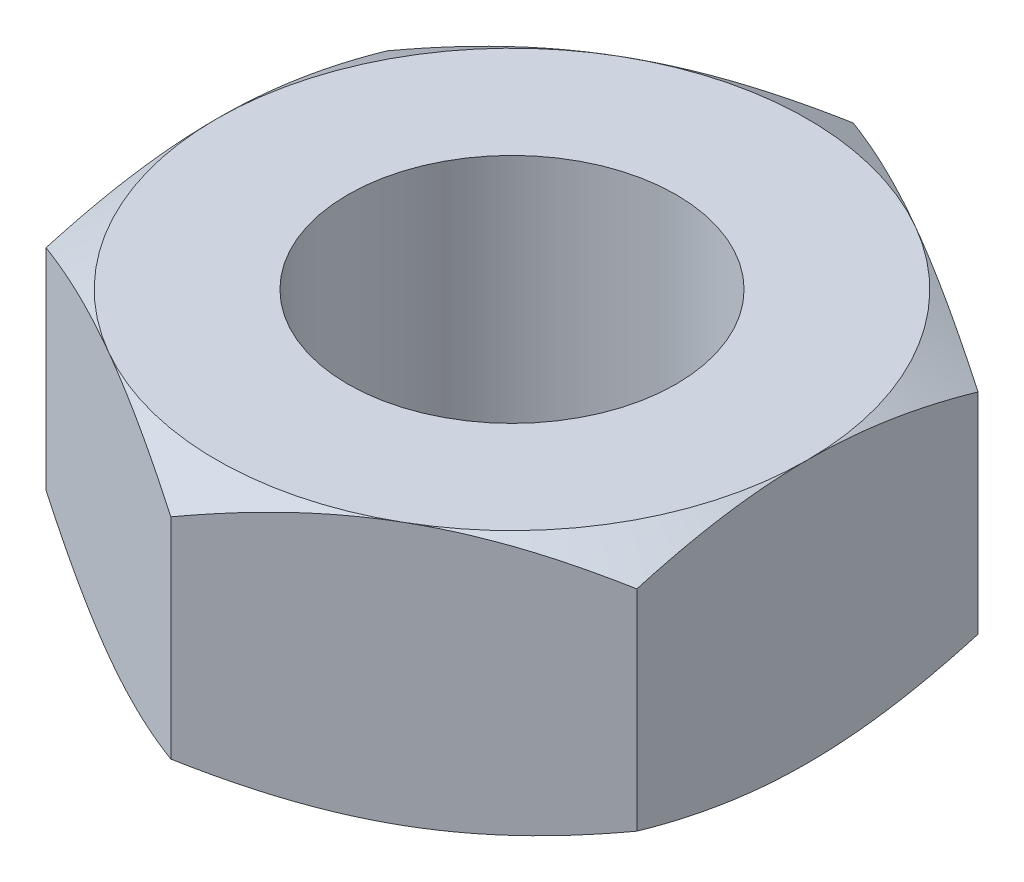
ISO-10303-21;
HEADER;
FILE_DESCRIPTION(('STEP AP214'),'2;1');
FILE_NAME('part.step','',(''),(''),'','','');
FILE_SCHEMA(('AUTOMOTIVE_DESIGN { 1 0 10303 214 1 1 1 1 }'));
ENDSEC;
DATA;
#1=APPLICATION_CONTEXT('core data for automotive mechanical design processes');
#2=APPLICATION_PROTOCOL_DEFINITION('international standard','automotive_design',2000,#1);
#3=PRODUCT_CONTEXT('',#1,'mechanical');
#4=PRODUCT('Part','Part','',(#3));
#5=PRODUCT_RELATED_PRODUCT_CATEGORY('part','',(#4));
#6=PRODUCT_DEFINITION_FORMATION('','',#4);
#7=PRODUCT_DEFINITION_CONTEXT('part definition',#1,'design');
#8=PRODUCT_DEFINITION('design','',#6,#7);
#9=PRODUCT_DEFINITION_SHAPE('','',#8);
#10=(LENGTH_UNIT() NAMED_UNIT(*) SI_UNIT(.MILLI.,.METRE.));
#11=(NAMED_UNIT(*) PLANE_ANGLE_UNIT() SI_UNIT($,.RADIAN.));
#12=(NAMED_UNIT(*) SI_UNIT($,.STERADIAN.) SOLID_ANGLE_UNIT());
#13=UNCERTAINTY_MEASURE_WITH_UNIT(LENGTH_MEASURE(1.E-05),#10,'distance_accuracy_value','');
#14=(GEOMETRIC_REPRESENTATION_CONTEXT(3) GLOBAL_UNCERTAINTY_ASSIGNED_CONTEXT((#13)) GLOBAL_UNIT_ASSIGNED_CONTEXT((#10,
#11,#12)) REPRESENTATION_CONTEXT('',''));
#15=CARTESIAN_POINT('',(0.,0.,0.));
#16=DIRECTION('',(0.,0.,1.));
#17=DIRECTION('',(1.,0.,0.));
#18=AXIS2_PLACEMENT_3D('',#15,#16,#17);
#19=CARTESIAN_POINT('',(2.25,2.,-1.29903810567666));
#20=DIRECTION('',(-0.5,0.,0.866025403784439));
#21=DIRECTION('',(0.866025403784439,0.,0.5));
#22=AXIS2_PLACEMENT_3D('',#19,#20,#21);
#23=PLANE('',#22);
#24=CARTESIAN_POINT('',(-0.000200000000000746,0.201028565434254,-2.59819168140715));
#25=CARTESIAN_POINT('',(0.0986772488143565,0.168055578047863,-2.54110487518745));
#26=CARTESIAN_POINT('',(0.198407997179093,0.138067535415597,-2.48352530077259));
#27=CARTESIAN_POINT('',(0.399596540220632,0.0857223882308776,-2.36736904128969));
#28=CARTESIAN_POINT('',(0.501057910502944,0.0633838027064784,-2.30879029184485));
#29=CARTESIAN_POINT('',(0.702723189801078,0.0286095576734187,-2.19235878855587));
#30=CARTESIAN_POINT('',(0.802896064976671,0.0159424738337181,-2.13452395210774));
#31=CARTESIAN_POINT('',(1.00371331260268,0.000818907417418591,-2.01858206013295));
#32=CARTESIAN_POINT('',(1.1043569548332,-0.00165009697600181,-1.96047542619893));
#33=CARTESIAN_POINT('',(1.29242516452656,0.00347837463602899,-1.85189419470646));
#34=CARTESIAN_POINT('',(1.37987784389126,0.00981663451512003,-1.8014033667339));
#35=CARTESIAN_POINT('',(1.55421343210877,0.0299076571898887,-1.70075066794718));
#36=CARTESIAN_POINT('',(1.64109573768829,0.0436672872310832,-1.65058914543304));
#37=CARTESIAN_POINT('',(1.81579095410173,0.078066265350665,-1.54972881521059));
#38=CARTESIAN_POINT('',(1.90358174743525,0.098851471582655,-1.49904277704711));
#39=CARTESIAN_POINT('',(2.07785373687759,0.146026087362979,-1.39842679703037));
#40=CARTESIAN_POINT('',(2.164337166751,0.172404408014301,-1.34849556551251));
#41=CARTESIAN_POINT('',(2.2502,0.201028565434254,-1.29892263562282));
#42=B_SPLINE_CURVE_WITH_KNOTS('',3,(#24,#25,#26,#27,#28,#29,#30,#31,#32,#33,#34,#35,#36,#37,#38,
#39,#40,#41),.UNSPECIFIED.,.F.,.F.,(4,2,2,2,2,2,2,2,4),(0.,0.356658826016552,0.714175103224236,
1.06284241804968,1.41108149062516,1.71433394539794,2.01786749258222,2.32813511279245,
2.63779325460359),.UNSPECIFIED.);
#43=CARTESIAN_POINT('',(0.,0.200961894323341,-2.59807621135332));
#44=VERTEX_POINT('',#43);
#45=CARTESIAN_POINT('',(1.125,0.,-1.94855715851499));
#46=VERTEX_POINT('',#45);
#47=EDGE_CURVE('E53',#44,#46,#42,.T.);
#48=ORIENTED_EDGE('',*,*,#47,.F.);
#49=DIRECTION('',(0.,-1.,0.));
#50=VECTOR('',#49,1.);
#51=CARTESIAN_POINT('',(0.,2.,-2.59807621135332));
#52=LINE('',#51,#50);
#53=CARTESIAN_POINT('',(0.,1.79903810567666,-2.59807621135332));
#54=VERTEX_POINT('',#53);
#55=EDGE_CURVE('E279',#54,#44,#52,.T.);
#56=ORIENTED_EDGE('',*,*,#55,.F.);
#57=CARTESIAN_POINT('',(2.2502,1.79897143456575,-1.29892263562282));
#58=CARTESIAN_POINT('',(2.15132275118564,1.83194442195214,-1.35600944184252));
#59=CARTESIAN_POINT('',(2.05159200282091,1.8619324645844,-1.41358901625738));
#60=CARTESIAN_POINT('',(1.85040345977937,1.91427761176912,-1.52974527574028));
#61=CARTESIAN_POINT('',(1.74894208949705,1.93661619729352,-1.58832402518513));
#62=CARTESIAN_POINT('',(1.54727681019892,1.97139044232658,-1.7047555284741));
#63=CARTESIAN_POINT('',(1.44710393502333,1.98405752616628,-1.76259036492223));
#64=CARTESIAN_POINT('',(1.24628668739732,1.99918109258258,-1.87853225689702));
#65=CARTESIAN_POINT('',(1.1456430451668,2.001650096976,-1.93663889083104));
#66=CARTESIAN_POINT('',(0.957574835473434,1.99652162536397,-2.04522012232352));
#67=CARTESIAN_POINT('',(0.870122156108741,1.99018336548488,-2.09571095029608));
#68=CARTESIAN_POINT('',(0.695786567891225,1.97009234281011,-2.19636364908279));
#69=CARTESIAN_POINT('',(0.608904262311711,1.95633271276892,-2.24652517159694));
#70=CARTESIAN_POINT('',(0.434209045898263,1.92193373464933,-2.34738550181938));
#71=CARTESIAN_POINT('',(0.346418252564746,1.90114852841734,-2.39807153998286));
#72=CARTESIAN_POINT('',(0.172146263122404,1.85397391263702,-2.49868751999961));
#73=CARTESIAN_POINT('',(0.0856628332489969,1.8275955919857,-2.54861875151746));
#74=CARTESIAN_POINT('',(-0.000200000000000684,1.79897143456575,-2.59819168140715));
#75=B_SPLINE_CURVE_WITH_KNOTS('',3,(#57,#58,#59,#60,#61,#62,#63,#64,#65,#66,#67,#68,#69,#70,#71,
#72,#73,#74),.UNSPECIFIED.,.F.,.F.,(4,2,2,2,2,2,2,2,4),(0.,0.356658826016552,0.714175103224236,
1.06284241804968,1.41108149062516,1.71433394539794,2.01786749258222,2.32813511279245,
2.63779325460359),.UNSPECIFIED.);
#76=CARTESIAN_POINT('',(1.125,2.,-1.94855715851499));
#77=VERTEX_POINT('',#76);
#78=EDGE_CURVE('E251',#77,#54,#75,.T.);
#79=ORIENTED_EDGE('',*,*,#78,.F.);
#80=CARTESIAN_POINT('',(2.25,1.79903810567666,-1.29903810567666));
#81=VERTEX_POINT('',#80);
#82=EDGE_CURVE('E319',#81,#77,#75,.T.);
#83=ORIENTED_EDGE('',*,*,#82,.F.);
#84=DIRECTION('',(0.,-1.,0.));
#85=VECTOR('',#84,1.);
#86=CARTESIAN_POINT('',(2.25,2.,-1.29903810567666));
#87=LINE('',#86,#85);
#88=CARTESIAN_POINT('',(2.25,0.200961894323341,-1.29903810567666));
#89=VERTEX_POINT('',#88);
#90=EDGE_CURVE('E321',#81,#89,#87,.T.);
#91=ORIENTED_EDGE('',*,*,#90,.T.);
#92=EDGE_CURVE('E138',#46,#89,#42,.T.);
#93=ORIENTED_EDGE('',*,*,#92,.F.);
#94=EDGE_LOOP('',(#48,#56,#79,#83,#91,#93));
#95=FACE_BOUND('',#94,.T.);
#96=ADVANCED_FACE('F37',(#95),#23,.F.);
#97=CARTESIAN_POINT('',(0.,2.,-2.59807621135332));
#98=DIRECTION('',(0.5,0.,0.866025403784438));
#99=DIRECTION('',(0.866025403784439,0.,-0.5));
#100=AXIS2_PLACEMENT_3D('',#97,#98,#99);
#101=PLANE('',#100);
#102=CARTESIAN_POINT('',(-2.2502,0.201028565434254,-1.29892263562282));
#103=CARTESIAN_POINT('',(-2.15132275118564,0.168055578047863,-1.35600944184252));
#104=CARTESIAN_POINT('',(-2.05159200282091,0.138067535415598,-1.41358901625738));
#105=CARTESIAN_POINT('',(-1.85040345977937,0.0857223882308777,-1.52974527574028));
#106=CARTESIAN_POINT('',(-1.74894208949705,0.0633838027064785,-1.58832402518512));
#107=CARTESIAN_POINT('',(-1.54727681019892,0.0286095576734186,-1.7047555284741));
#108=CARTESIAN_POINT('',(-1.44710393502333,0.015942473833718,-1.76259036492223));
#109=CARTESIAN_POINT('',(-1.24628668739732,0.000818907417418527,-1.87853225689702));
#110=CARTESIAN_POINT('',(-1.1456430451668,-0.00165009697600169,-1.93663889083104));
#111=CARTESIAN_POINT('',(-0.957574835473435,0.00347837463602923,-2.04522012232352));
#112=CARTESIAN_POINT('',(-0.870122156108742,0.00981663451512021,-2.09571095029608));
#113=CARTESIAN_POINT('',(-0.695786567891226,0.0299076571898888,-2.19636364908279));
#114=CARTESIAN_POINT('',(-0.608904262311712,0.0436672872310833,-2.24652517159694));
#115=CARTESIAN_POINT('',(-0.434209045898264,0.0780662653506652,-2.34738550181938));
#116=CARTESIAN_POINT('',(-0.346418252564747,0.0988514715826553,-2.39807153998286));
#117=CARTESIAN_POINT('',(-0.172146263122406,0.146026087362979,-2.49868751999961));
#118=CARTESIAN_POINT('',(-0.0856628332489986,0.172404408014302,-2.54861875151746));
#119=CARTESIAN_POINT('',(0.000199999999999082,0.201028565434254,-2.59819168140715));
#120=B_SPLINE_CURVE_WITH_KNOTS('',3,(#102,#103,#104,#105,#106,#107,#108,#109,#110,#111,#112,
#113,#114,#115,#116,#117,#118,#119),.UNSPECIFIED.,.F.,.F.,(4,2,2,2,2,2,2,2,4),(0.,
0.356658826016552,0.714175103224237,1.06284241804968,1.41108149062516,1.71433394539794,
2.01786749258222,2.32813511279245,2.63779325460359),.UNSPECIFIED.);
#121=CARTESIAN_POINT('',(-2.25,0.200961894323341,-1.29903810567666));
#122=VERTEX_POINT('',#121);
#123=CARTESIAN_POINT('',(-1.125,0.,-1.94855715851499));
#124=VERTEX_POINT('',#123);
#125=EDGE_CURVE('E61',#122,#124,#120,.T.);
#126=ORIENTED_EDGE('',*,*,#125,.F.);
#127=DIRECTION('',(0.,-1.,0.));
#128=VECTOR('',#127,1.);
#129=CARTESIAN_POINT('',(-2.25,2.,-1.29903810567666));
#130=LINE('',#129,#128);
#131=CARTESIAN_POINT('',(-2.25,1.79903810567666,-1.29903810567666));
#132=VERTEX_POINT('',#131);
#133=EDGE_CURVE('E272',#132,#122,#130,.T.);
#134=ORIENTED_EDGE('',*,*,#133,.F.);
#135=CARTESIAN_POINT('',(0.000199999999999188,1.79897143456575,-2.59819168140715));
#136=CARTESIAN_POINT('',(-0.098677248814358,1.83194442195214,-2.54110487518745));
#137=CARTESIAN_POINT('',(-0.198407997179094,1.8619324645844,-2.48352530077259));
#138=CARTESIAN_POINT('',(-0.399596540220633,1.91427761176912,-2.36736904128969));
#139=CARTESIAN_POINT('',(-0.501057910502946,1.93661619729352,-2.30879029184485));
#140=CARTESIAN_POINT('',(-0.702723189801079,1.97139044232658,-2.19235878855587));
#141=CARTESIAN_POINT('',(-0.802896064976672,1.98405752616628,-2.13452395210774));
#142=CARTESIAN_POINT('',(-1.00371331260268,1.99918109258258,-2.01858206013295));
#143=CARTESIAN_POINT('',(-1.1043569548332,2.001650096976,-1.96047542619893));
#144=CARTESIAN_POINT('',(-1.29242516452657,1.99652162536397,-1.85189419470646));
#145=CARTESIAN_POINT('',(-1.37987784389126,1.99018336548488,-1.8014033667339));
#146=CARTESIAN_POINT('',(-1.55421343210877,1.97009234281011,-1.70075066794718));
#147=CARTESIAN_POINT('',(-1.64109573768829,1.95633271276892,-1.65058914543303));
#148=CARTESIAN_POINT('',(-1.81579095410174,1.92193373464934,-1.54972881521059));
#149=CARTESIAN_POINT('',(-1.90358174743525,1.90114852841734,-1.49904277704711));
#150=CARTESIAN_POINT('',(-2.07785373687759,1.85397391263702,-1.39842679703037));
#151=CARTESIAN_POINT('',(-2.164337166751,1.8275955919857,-1.34849556551251));
#152=CARTESIAN_POINT('',(-2.2502,1.79897143456575,-1.29892263562282));
#153=B_SPLINE_CURVE_WITH_KNOTS('',3,(#135,#136,#137,#138,#139,#140,#141,#142,#143,#144,#145,
#146,#147,#148,#149,#150,#151,#152),.UNSPECIFIED.,.F.,.F.,(4,2,2,2,2,2,2,2,4),(0.,
0.356658826016552,0.714175103224236,1.06284241804968,1.41108149062516,1.71433394539794,
2.01786749258222,2.32813511279245,2.63779325460359),.UNSPECIFIED.);
#154=CARTESIAN_POINT('',(-1.125,2.,-1.94855715851499));
#155=VERTEX_POINT('',#154);
#156=EDGE_CURVE('E244',#155,#132,#153,.T.);
#157=ORIENTED_EDGE('',*,*,#156,.F.);
#158=EDGE_CURVE('E250',#54,#155,#153,.T.);
#159=ORIENTED_EDGE('',*,*,#158,.F.);
#160=ORIENTED_EDGE('',*,*,#55,.T.);
#161=EDGE_CURVE('E161',#124,#44,#120,.T.);
#162=ORIENTED_EDGE('',*,*,#161,.F.);
#163=EDGE_LOOP('',(#126,#134,#157,#159,#160,#162));
#164=FACE_BOUND('',#163,.T.);
#165=ADVANCED_FACE('F257',(#164),#101,.F.);
#166=CARTESIAN_POINT('',(-2.25,2.,-1.29903810567666));
#167=DIRECTION('',(1.,0.,0.));
#168=DIRECTION('',(0.,0.,-1.));
#169=AXIS2_PLACEMENT_3D('',#166,#167,#168);
#170=PLANE('',#169);
#171=CARTESIAN_POINT('',(-2.25,1.61654080244333,4.52098452866437));
#172=CARTESIAN_POINT('',(-2.25,1.5622793592188,4.41599142010916));
#173=CARTESIAN_POINT('',(-2.25,1.50830287728152,4.3108497874335));
#174=CARTESIAN_POINT('',(-2.25,1.40106366051152,4.10020109263545));
#175=CARTESIAN_POINT('',(-2.25,1.34780093790971,3.99469402428986));
#176=CARTESIAN_POINT('',(-2.25,1.2420515368529,3.78308278811094));
#177=CARTESIAN_POINT('',(-2.25,1.18956621605644,3.67697794065521));
#178=CARTESIAN_POINT('',(-2.25,1.08565573015514,3.46424778031012));
#179=CARTESIAN_POINT('',(-2.25,1.0342305798221,3.35762246019437));
#180=CARTESIAN_POINT('',(-2.25,0.929974137069096,3.13800936941928));
#181=CARTESIAN_POINT('',(-2.25,0.877215361007394,3.02498707842674));
#182=CARTESIAN_POINT('',(-2.25,0.773561201286874,2.79809197620436));
#183=CARTESIAN_POINT('',(-2.25,0.722665769410085,2.6842191870749));
#184=CARTESIAN_POINT('',(-2.25,0.623312980238853,2.45549954074309));
#185=CARTESIAN_POINT('',(-2.25,0.574854022311475,2.34065338251795));
#186=CARTESIAN_POINT('',(-2.25,0.481072364029686,2.10965053432443));
#187=CARTESIAN_POINT('',(-2.25,0.435750370947091,1.99349355563509));
#188=CARTESIAN_POINT('',(-2.25,0.342786865540116,1.74211109324837));
#189=CARTESIAN_POINT('',(-2.25,0.295814277167548,1.60663482148118));
#190=CARTESIAN_POINT('',(-2.25,0.209504971922834,1.3332954791331));
#191=CARTESIAN_POINT('',(-2.25,0.170164497661105,1.19543361960658));
#192=CARTESIAN_POINT('',(-2.25,0.102545421444101,0.91980771299549));
#193=CARTESIAN_POINT('',(-2.25,0.0740661287099882,0.782094149233205));
#194=CARTESIAN_POINT('',(-2.25,0.0300512713647035,0.504588051380634));
#195=CARTESIAN_POINT('',(-2.25,0.0145079988791757,0.364796805887861));
#196=CARTESIAN_POINT('',(-2.25,0.00237042253740857,0.153462339780306));
#197=CARTESIAN_POINT('',(-2.25,0.000213996781182723,0.0822117789549771));
#198=CARTESIAN_POINT('',(-2.25,-0.000183212053853032,-0.0603054030350468));
#199=CARTESIAN_POINT('',(-2.25,0.00157599640119419,-0.131572024164684));
#200=CARTESIAN_POINT('',(-2.25,0.00895020570216545,-0.273914915401414));
#201=CARTESIAN_POINT('',(-2.25,0.0145658718900124,-0.344991150537271));
#202=CARTESIAN_POINT('',(-2.25,0.029441678996056,-0.48676591860894));
#203=CARTESIAN_POINT('',(-2.25,0.0387024235819218,-0.557464387015442));
#204=CARTESIAN_POINT('',(-2.25,0.071946724543369,-0.771646015798237));
#205=CARTESIAN_POINT('',(-2.25,0.101223215970863,-0.914319075380874));
#206=CARTESIAN_POINT('',(-2.25,0.170517946349336,-1.19697326353253));
#207=CARTESIAN_POINT('',(-2.25,0.210540113399167,-1.33695338760176));
#208=CARTESIAN_POINT('',(-2.25,0.29773955454535,-1.61234208513247));
#209=CARTESIAN_POINT('',(-2.25,0.34480189493785,-1.74778767009234));
#210=CARTESIAN_POINT('',(-2.25,0.444406417047665,-2.01666306398133));
#211=CARTESIAN_POINT('',(-2.25,0.496950100596509,-2.15009230892905));
#212=CARTESIAN_POINT('',(-2.25,0.606064881357971,-2.41545563737938));
#213=CARTESIAN_POINT('',(-2.25,0.66264044094819,-2.5473878708551));
#214=CARTESIAN_POINT('',(-2.25,0.778720831616846,-2.8099590060791));
#215=CARTESIAN_POINT('',(-2.25,0.838225833570133,-2.94059783184758));
#216=CARTESIAN_POINT('',(-2.25,0.955861758041666,-3.19318812855259));
#217=CARTESIAN_POINT('',(-2.25,1.01386731062023,-3.31519822826409));
#218=CARTESIAN_POINT('',(-2.25,1.13138940640331,-3.55849232400213));
#219=CARTESIAN_POINT('',(-2.25,1.19090600389569,-3.67977629374671));
#220=CARTESIAN_POINT('',(-2.25,1.31091123446663,-3.92132491393736));
#221=CARTESIAN_POINT('',(-2.25,1.37139567148893,-4.04159165394789));
#222=CARTESIAN_POINT('',(-2.25,1.49331218297334,-4.28163063441634));
#223=CARTESIAN_POINT('',(-2.25,1.5547441718645,-4.40140291830326));
#224=CARTESIAN_POINT('',(-2.25,1.61654080244333,-4.52098452866437));
#225=B_SPLINE_CURVE_WITH_KNOTS('',3,(#171,#172,#173,#174,#175,#176,#177,#178,#179,#180,#181,
#182,#183,#184,#185,#186,#187,#188,#189,#190,#191,#192,#193,#194,#195,#196,#197,#198,#199,#200,
#201,#202,#203,#204,#205,#206,#207,#208,#209,#210,#211,#212,#213,#214,#215,#216,#217,#218,#219,
#220,#221,#222,#223,#224),.UNSPECIFIED.,.F.,.F.,(4,2,2,2,2,2,2,2,2,2,2,2,2,2,2,2,2,2,2,2,2,2,2,
2,2,2,4),(0.,0.354558289452689,0.709122646842152,1.06424666910254,1.4193756361108,
1.79355189161133,2.16771845765633,2.54163591555203,2.91563740549302,3.34564307397043,
3.77543650480265,4.19685151312074,4.61801524290633,4.83177056313858,5.0455254212027,
5.25931716695487,5.47314433403134,5.90946317070491,6.34594172209233,6.77594617504564,
7.20606875577625,7.63667500851675,8.06730640841919,8.47258371771617,8.87787560822175,
9.28173008673865,9.68554830529466),.UNSPECIFIED.);
#226=CARTESIAN_POINT('',(-2.25,0.20096189432334,1.29903810567666));
#227=VERTEX_POINT('',#226);
#228=CARTESIAN_POINT('',(-2.25,0.,0.));
#229=VERTEX_POINT('',#228);
#230=EDGE_CURVE('E348',#227,#229,#225,.T.);
#231=ORIENTED_EDGE('',*,*,#230,.F.);
#232=DIRECTION('',(0.,-1.,0.));
#233=VECTOR('',#232,1.);
#234=CARTESIAN_POINT('',(-2.25,2.,1.29903810567666));
#235=LINE('',#234,#233);
#236=CARTESIAN_POINT('',(-2.25,1.79903810567666,1.29903810567666));
#237=VERTEX_POINT('',#236);
#238=EDGE_CURVE('E280',#237,#227,#235,.T.);
#239=ORIENTED_EDGE('',*,*,#238,.F.);
#240=CARTESIAN_POINT('',(-2.25,0.383459197556667,-4.52098452866437));
#241=CARTESIAN_POINT('',(-2.25,0.437720640781204,-4.41599142010916));
#242=CARTESIAN_POINT('',(-2.25,0.491697122718478,-4.3108497874335));
#243=CARTESIAN_POINT('',(-2.25,0.598936339488484,-4.10020109263545));
#244=CARTESIAN_POINT('',(-2.25,0.652199062090288,-3.99469402428986));
#245=CARTESIAN_POINT('',(-2.25,0.757948463147099,-3.78308278811094));
#246=CARTESIAN_POINT('',(-2.25,0.810433783943564,-3.67697794065521));
#247=CARTESIAN_POINT('',(-2.25,0.91434426984486,-3.46424778031012));
#248=CARTESIAN_POINT('',(-2.25,0.965769420177905,-3.35762246019437));
#249=CARTESIAN_POINT('',(-2.25,1.0700258629309,-3.13800936941928));
#250=CARTESIAN_POINT('',(-2.25,1.12278463899261,-3.02498707842674));
#251=CARTESIAN_POINT('',(-2.25,1.22643879871313,-2.79809197620436));
#252=CARTESIAN_POINT('',(-2.25,1.27733423058991,-2.6842191870749));
#253=CARTESIAN_POINT('',(-2.25,1.37668701976115,-2.45549954074309));
#254=CARTESIAN_POINT('',(-2.25,1.42514597768852,-2.34065338251795));
#255=CARTESIAN_POINT('',(-2.25,1.51892763597031,-2.10965053432443));
#256=CARTESIAN_POINT('',(-2.25,1.56424962905291,-1.99349355563509));
#257=CARTESIAN_POINT('',(-2.25,1.65721313445988,-1.74211109324837));
#258=CARTESIAN_POINT('',(-2.25,1.70418572283245,-1.60663482148118));
#259=CARTESIAN_POINT('',(-2.25,1.79049502807717,-1.3332954791331));
#260=CARTESIAN_POINT('',(-2.25,1.82983550233889,-1.19543361960658));
#261=CARTESIAN_POINT('',(-2.25,1.8974545785559,-0.91980771299549));
#262=CARTESIAN_POINT('',(-2.25,1.92593387129001,-0.782094149233205));
#263=CARTESIAN_POINT('',(-2.25,1.9699487286353,-0.504588051380634));
#264=CARTESIAN_POINT('',(-2.25,1.98549200112082,-0.36479680588786));
#265=CARTESIAN_POINT('',(-2.25,1.99762957746259,-0.153462339780305));
#266=CARTESIAN_POINT('',(-2.25,1.99978600321882,-0.0822117789549759));
#267=CARTESIAN_POINT('',(-2.25,2.00018321205385,0.0603054030350482));
#268=CARTESIAN_POINT('',(-2.25,1.99842400359881,0.131572024164685));
#269=CARTESIAN_POINT('',(-2.25,1.99104979429783,0.273914915401416));
#270=CARTESIAN_POINT('',(-2.25,1.98543412810999,0.344991150537272));
#271=CARTESIAN_POINT('',(-2.25,1.97055832100394,0.486765918608942));
#272=CARTESIAN_POINT('',(-2.25,1.96129757641808,0.557464387015443));
#273=CARTESIAN_POINT('',(-2.25,1.92805327545663,0.771646015798238));
#274=CARTESIAN_POINT('',(-2.25,1.89877678402914,0.914319075380875));
#275=CARTESIAN_POINT('',(-2.25,1.82948205365066,1.19697326353253));
#276=CARTESIAN_POINT('',(-2.25,1.78945988660083,1.33695338760176));
#277=CARTESIAN_POINT('',(-2.25,1.70226044545465,1.61234208513247));
#278=CARTESIAN_POINT('',(-2.25,1.65519810506215,1.74778767009234));
#279=CARTESIAN_POINT('',(-2.25,1.55559358295234,2.01666306398134));
#280=CARTESIAN_POINT('',(-2.25,1.50304989940349,2.15009230892905));
#281=CARTESIAN_POINT('',(-2.25,1.39393511864203,2.41545563737938));
#282=CARTESIAN_POINT('',(-2.25,1.33735955905181,2.5473878708551));
#283=CARTESIAN_POINT('',(-2.25,1.22127916838315,2.8099590060791));
#284=CARTESIAN_POINT('',(-2.25,1.16177416642987,2.94059783184758));
#285=CARTESIAN_POINT('',(-2.25,1.04413824195833,3.19318812855259));
#286=CARTESIAN_POINT('',(-2.25,0.986132689379768,3.31519822826409));
#287=CARTESIAN_POINT('',(-2.25,0.868610593596688,3.55849232400213));
#288=CARTESIAN_POINT('',(-2.25,0.80909399610431,3.67977629374671));
#289=CARTESIAN_POINT('',(-2.25,0.689088765533375,3.92132491393736));
#290=CARTESIAN_POINT('',(-2.25,0.628604328511072,4.04159165394789));
#291=CARTESIAN_POINT('',(-2.25,0.506687817026662,4.28163063441634));
#292=CARTESIAN_POINT('',(-2.25,0.4452558281355,4.40140291830326));
#293=CARTESIAN_POINT('',(-2.25,0.383459197556667,4.52098452866437));
#294=B_SPLINE_CURVE_WITH_KNOTS('',3,(#240,#241,#242,#243,#244,#245,#246,#247,#248,#249,#250,
#251,#252,#253,#254,#255,#256,#257,#258,#259,#260,#261,#262,#263,#264,#265,#266,#267,#268,#269,
#270,#271,#272,#273,#274,#275,#276,#277,#278,#279,#280,#281,#282,#283,#284,#285,#286,#287,#288,
#289,#290,#291,#292,#293),.UNSPECIFIED.,.F.,.F.,(4,2,2,2,2,2,2,2,2,2,2,2,2,2,2,2,2,2,2,2,2,2,2,
2,2,2,4),(0.,0.354558289452689,0.709122646842153,1.06424666910254,1.4193756361108,
1.79355189161133,2.16771845765633,2.54163591555203,2.91563740549302,3.34564307397043,
3.77543650480265,4.19685151312074,4.61801524290633,4.83177056313858,5.0455254212027,
5.25931716695488,5.47314433403134,5.90946317070491,6.34594172209233,6.77594617504564,
7.20606875577625,7.63667500851675,8.06730640841919,8.47258371771617,8.87787560822174,
9.28173008673864,9.68554830529466),.UNSPECIFIED.);
#295=CARTESIAN_POINT('',(-2.25,2.,0.));
#296=VERTEX_POINT('',#295);
#297=EDGE_CURVE('E237',#296,#237,#294,.T.);
#298=ORIENTED_EDGE('',*,*,#297,.F.);
#299=EDGE_CURVE('E243',#132,#296,#294,.T.);
#300=ORIENTED_EDGE('',*,*,#299,.F.);
#301=ORIENTED_EDGE('',*,*,#133,.T.);
#302=EDGE_CURVE('E196',#229,#122,#225,.T.);
#303=ORIENTED_EDGE('',*,*,#302,.F.);
#304=EDGE_LOOP('',(#231,#239,#298,#300,#301,#303));
#305=FACE_BOUND('',#304,.T.);
#306=ADVANCED_FACE('F218',(#305),#170,.F.);
#307=CARTESIAN_POINT('',(-2.25,2.,1.29903810567666));
#308=DIRECTION('',(0.5,0.,-0.866025403784439));
#309=DIRECTION('',(-0.866025403784439,0.,-0.5));
#310=AXIS2_PLACEMENT_3D('',#307,#308,#309);
#311=PLANE('',#310);
#312=CARTESIAN_POINT('',(0.000200000000000397,0.201028565434254,2.59819168140715));
#313=CARTESIAN_POINT('',(-0.0986772488143568,0.168055578047863,2.54110487518745));
#314=CARTESIAN_POINT('',(-0.198407997179093,0.138067535415597,2.48352530077259));
#315=CARTESIAN_POINT('',(-0.399596540220632,0.0857223882308776,2.36736904128969));
#316=CARTESIAN_POINT('',(-0.501057910502945,0.0633838027064783,2.30879029184485));
#317=CARTESIAN_POINT('',(-0.702723189801078,0.0286095576734186,2.19235878855587));
#318=CARTESIAN_POINT('',(-0.802896064976671,0.015942473833718,2.13452395210774));
#319=CARTESIAN_POINT('',(-1.00371331260268,0.000818907417418585,2.01858206013295));
#320=CARTESIAN_POINT('',(-1.1043569548332,-0.00165009697600175,1.96047542619893));
#321=CARTESIAN_POINT('',(-1.29242516452656,0.00347837463602894,1.85189419470646));
#322=CARTESIAN_POINT('',(-1.37987784389126,0.00981663451511984,1.8014033667339));
#323=CARTESIAN_POINT('',(-1.55421343210877,0.0299076571898885,1.70075066794718));
#324=CARTESIAN_POINT('',(-1.64109573768829,0.0436672872310831,1.65058914543304));
#325=CARTESIAN_POINT('',(-1.81579095410174,0.078066265350665,1.54972881521059));
#326=CARTESIAN_POINT('',(-1.90358174743525,0.0988514715826551,1.49904277704711));
#327=CARTESIAN_POINT('',(-2.07785373687759,0.146026087362979,1.39842679703037));
#328=CARTESIAN_POINT('',(-2.164337166751,0.172404408014301,1.34849556551251));
#329=CARTESIAN_POINT('',(-2.2502,0.201028565434254,1.29892263562282));
#330=B_SPLINE_CURVE_WITH_KNOTS('',3,(#312,#313,#314,#315,#316,#317,#318,#319,#320,#321,#322,
#323,#324,#325,#326,#327,#328,#329),.UNSPECIFIED.,.F.,.F.,(4,2,2,2,2,2,2,2,4),(0.,
0.356658826016552,0.714175103224236,1.06284241804968,1.41108149062516,1.71433394539794,
2.01786749258222,2.32813511279245,2.63779325460359),.UNSPECIFIED.);
#331=CARTESIAN_POINT('',(0.,0.200961894323341,2.59807621135332));
#332=VERTEX_POINT('',#331);
#333=CARTESIAN_POINT('',(-1.125,0.,1.94855715851499));
#334=VERTEX_POINT('',#333);
#335=EDGE_CURVE('E147',#332,#334,#330,.T.);
#336=ORIENTED_EDGE('',*,*,#335,.F.);
#337=DIRECTION('',(0.,-1.,0.));
#338=VECTOR('',#337,1.);
#339=CARTESIAN_POINT('',(0.,2.,2.59807621135332));
#340=LINE('',#339,#338);
#341=CARTESIAN_POINT('',(0.,1.79903810567666,2.59807621135332));
#342=VERTEX_POINT('',#341);
#343=EDGE_CURVE('E160',#342,#332,#340,.T.);
#344=ORIENTED_EDGE('',*,*,#343,.F.);
#345=CARTESIAN_POINT('',(-2.2502,1.79897143456575,1.29892263562282));
#346=CARTESIAN_POINT('',(-2.15132275118564,1.83194442195214,1.35600944184252));
#347=CARTESIAN_POINT('',(-2.05159200282091,1.8619324645844,1.41358901625738));
#348=CARTESIAN_POINT('',(-1.85040345977937,1.91427761176912,1.52974527574028));
#349=CARTESIAN_POINT('',(-1.74894208949705,1.93661619729352,1.58832402518512));
#350=CARTESIAN_POINT('',(-1.54727681019892,1.97139044232658,1.7047555284741));
#351=CARTESIAN_POINT('',(-1.44710393502333,1.98405752616628,1.76259036492223));
#352=CARTESIAN_POINT('',(-1.24628668739732,1.99918109258258,1.87853225689702));
#353=CARTESIAN_POINT('',(-1.1456430451668,2.001650096976,1.93663889083104));
#354=CARTESIAN_POINT('',(-0.957574835473434,1.99652162536397,2.04522012232352));
#355=CARTESIAN_POINT('',(-0.870122156108741,1.99018336548488,2.09571095029608));
#356=CARTESIAN_POINT('',(-0.695786567891225,1.97009234281011,2.19636364908279));
#357=CARTESIAN_POINT('',(-0.608904262311711,1.95633271276892,2.24652517159694));
#358=CARTESIAN_POINT('',(-0.434209045898264,1.92193373464934,2.34738550181938));
#359=CARTESIAN_POINT('',(-0.346418252564746,1.90114852841734,2.39807153998286));
#360=CARTESIAN_POINT('',(-0.172146263122405,1.85397391263702,2.49868751999961));
#361=CARTESIAN_POINT('',(-0.0856628332489976,1.8275955919857,2.54861875151746));
#362=CARTESIAN_POINT('',(0.000200000000000375,1.79897143456575,2.59819168140715));
#363=B_SPLINE_CURVE_WITH_KNOTS('',3,(#345,#346,#347,#348,#349,#350,#351,#352,#353,#354,#355,
#356,#357,#358,#359,#360,#361,#362),.UNSPECIFIED.,.F.,.F.,(4,2,2,2,2,2,2,2,4),(0.,
0.356658826016552,0.714175103224236,1.06284241804968,1.41108149062516,1.71433394539794,
2.01786749258222,2.32813511279245,2.63779325460359),.UNSPECIFIED.);
#364=CARTESIAN_POINT('',(-1.125,2.,1.94855715851499));
#365=VERTEX_POINT('',#364);
#366=EDGE_CURVE('E223',#365,#342,#363,.T.);
#367=ORIENTED_EDGE('',*,*,#366,.F.);
#368=EDGE_CURVE('E230',#237,#365,#363,.T.);
#369=ORIENTED_EDGE('',*,*,#368,.F.);
#370=ORIENTED_EDGE('',*,*,#238,.T.);
#371=EDGE_CURVE('E163',#334,#227,#330,.T.);
#372=ORIENTED_EDGE('',*,*,#371,.F.);
#373=EDGE_LOOP('',(#336,#344,#367,#369,#370,#372));
#374=FACE_BOUND('',#373,.T.);
#375=ADVANCED_FACE('F215',(#374),#311,.F.);
#376=CARTESIAN_POINT('',(0.,2.,2.59807621135332));
#377=DIRECTION('',(-0.5,0.,-0.866025403784439));
#378=DIRECTION('',(-0.866025403784439,0.,0.5));
#379=AXIS2_PLACEMENT_3D('',#376,#377,#378);
#380=PLANE('',#379);
#381=CARTESIAN_POINT('',(2.2502,0.201028565434254,1.29892263562282));
#382=CARTESIAN_POINT('',(2.15132275118564,0.168055578047864,1.35600944184252));
#383=CARTESIAN_POINT('',(2.05159200282091,0.138067535415598,1.41358901625738));
#384=CARTESIAN_POINT('',(1.85040345977937,0.0857223882308778,1.52974527574028));
#385=CARTESIAN_POINT('',(1.74894208949705,0.0633838027064785,1.58832402518512));
#386=CARTESIAN_POINT('',(1.54727681019892,0.0286095576734186,1.7047555284741));
#387=CARTESIAN_POINT('',(1.44710393502333,0.0159424738337181,1.76259036492223));
#388=CARTESIAN_POINT('',(1.24628668739732,0.00081890741741863,1.87853225689702));
#389=CARTESIAN_POINT('',(1.1456430451668,-0.00165009697600175,1.93663889083104));
#390=CARTESIAN_POINT('',(0.957574835473435,0.00347837463602906,2.04522012232352));
#391=CARTESIAN_POINT('',(0.870122156108742,0.00981663451512008,2.09571095029608));
#392=CARTESIAN_POINT('',(0.695786567891226,0.0299076571898888,2.19636364908279));
#393=CARTESIAN_POINT('',(0.608904262311712,0.0436672872310834,2.24652517159694));
#394=CARTESIAN_POINT('',(0.434209045898264,0.0780662653506652,2.34738550181938));
#395=CARTESIAN_POINT('',(0.346418252564747,0.0988514715826553,2.39807153998286));
#396=CARTESIAN_POINT('',(0.172146263122405,0.146026087362979,2.49868751999961));
#397=CARTESIAN_POINT('',(0.0856628332489982,0.172404408014302,2.54861875151746));
#398=CARTESIAN_POINT('',(-0.000199999999999515,0.201028565434254,2.59819168140715));
#399=B_SPLINE_CURVE_WITH_KNOTS('',3,(#381,#382,#383,#384,#385,#386,#387,#388,#389,#390,#391,
#392,#393,#394,#395,#396,#397,#398),.UNSPECIFIED.,.F.,.F.,(4,2,2,2,2,2,2,2,4),(0.,
0.356658826016552,0.714175103224236,1.06284241804968,1.41108149062516,1.71433394539794,
2.01786749258222,2.32813511279245,2.63779325460359),.UNSPECIFIED.);
#400=CARTESIAN_POINT('',(2.25,0.200961894323338,1.29903810567666));
#401=VERTEX_POINT('',#400);
#402=CARTESIAN_POINT('',(1.125,0.,1.94855715851499));
#403=VERTEX_POINT('',#402);
#404=EDGE_CURVE('E127',#401,#403,#399,.T.);
#405=ORIENTED_EDGE('',*,*,#404,.F.);
#406=DIRECTION('',(0.,-1.,0.));
#407=VECTOR('',#406,1.);
#408=CARTESIAN_POINT('',(2.25,2.,1.29903810567666));
#409=LINE('',#408,#407);
#410=CARTESIAN_POINT('',(2.25,1.79903810567666,1.29903810567666));
#411=VERTEX_POINT('',#410);
#412=EDGE_CURVE('E326',#411,#401,#409,.T.);
#413=ORIENTED_EDGE('',*,*,#412,.F.);
#414=CARTESIAN_POINT('',(-0.000199999999999544,1.79897143456575,2.59819168140715));
#415=CARTESIAN_POINT('',(0.0986772488143578,1.83194442195214,2.54110487518745));
#416=CARTESIAN_POINT('',(0.198407997179094,1.8619324645844,2.48352530077259));
#417=CARTESIAN_POINT('',(0.399596540220633,1.91427761176912,2.36736904128969));
#418=CARTESIAN_POINT('',(0.501057910502946,1.93661619729352,2.30879029184485));
#419=CARTESIAN_POINT('',(0.702723189801079,1.97139044232658,2.19235878855587));
#420=CARTESIAN_POINT('',(0.802896064976672,1.98405752616628,2.13452395210774));
#421=CARTESIAN_POINT('',(1.00371331260268,1.99918109258258,2.01858206013295));
#422=CARTESIAN_POINT('',(1.1043569548332,2.001650096976,1.96047542619893));
#423=CARTESIAN_POINT('',(1.29242516452657,1.99652162536397,1.85189419470646));
#424=CARTESIAN_POINT('',(1.37987784389126,1.99018336548488,1.8014033667339));
#425=CARTESIAN_POINT('',(1.55421343210877,1.97009234281011,1.70075066794718));
#426=CARTESIAN_POINT('',(1.64109573768829,1.95633271276892,1.65058914543304));
#427=CARTESIAN_POINT('',(1.81579095410174,1.92193373464933,1.54972881521059));
#428=CARTESIAN_POINT('',(1.90358174743525,1.90114852841734,1.49904277704711));
#429=CARTESIAN_POINT('',(2.07785373687759,1.85397391263702,1.39842679703037));
#430=CARTESIAN_POINT('',(2.164337166751,1.8275955919857,1.34849556551251));
#431=CARTESIAN_POINT('',(2.2502,1.79897143456575,1.29892263562282));
#432=B_SPLINE_CURVE_WITH_KNOTS('',3,(#414,#415,#416,#417,#418,#419,#420,#421,#422,#423,#424,
#425,#426,#427,#428,#429,#430,#431),.UNSPECIFIED.,.F.,.F.,(4,2,2,2,2,2,2,2,4),(0.,
0.356658826016552,0.714175103224236,1.06284241804968,1.41108149062516,1.71433394539794,
2.01786749258222,2.32813511279245,2.63779325460359),.UNSPECIFIED.);
#433=CARTESIAN_POINT('',(1.125,2.,1.94855715851499));
#434=VERTEX_POINT('',#433);
#435=EDGE_CURVE('E232',#434,#411,#432,.T.);
#436=ORIENTED_EDGE('',*,*,#435,.F.);
#437=EDGE_CURVE('E231',#342,#434,#432,.T.);
#438=ORIENTED_EDGE('',*,*,#437,.F.);
#439=ORIENTED_EDGE('',*,*,#343,.T.);
#440=EDGE_CURVE('E141',#403,#332,#399,.T.);
#441=ORIENTED_EDGE('',*,*,#440,.F.);
#442=EDGE_LOOP('',(#405,#413,#436,#438,#439,#441));
#443=FACE_BOUND('',#442,.T.);
#444=ADVANCED_FACE('F157',(#443),#380,.F.);
#445=CARTESIAN_POINT('',(2.25,2.,1.29903810567666));
#446=DIRECTION('',(-1.,0.,0.));
#447=DIRECTION('',(0.,0.,1.));
#448=AXIS2_PLACEMENT_3D('',#445,#446,#447);
#449=PLANE('',#448);
#450=CARTESIAN_POINT('',(2.25,1.61654080244333,-4.52098452866438));
#451=CARTESIAN_POINT('',(2.25,1.5622793592188,-4.41599142010916));
#452=CARTESIAN_POINT('',(2.25,1.50830287728152,-4.31084978743351));
#453=CARTESIAN_POINT('',(2.25,1.40106366051152,-4.10020109263545));
#454=CARTESIAN_POINT('',(2.25,1.34780093790971,-3.99469402428986));
#455=CARTESIAN_POINT('',(2.25,1.2420515368529,-3.78308278811095));
#456=CARTESIAN_POINT('',(2.25,1.18956621605644,-3.67697794065521));
#457=CARTESIAN_POINT('',(2.25,1.08565573015514,-3.46424778031012));
#458=CARTESIAN_POINT('',(2.25,1.0342305798221,-3.35762246019438));
#459=CARTESIAN_POINT('',(2.25,0.929974137069097,-3.13800936941928));
#460=CARTESIAN_POINT('',(2.25,0.877215361007395,-3.02498707842674));
#461=CARTESIAN_POINT('',(2.25,0.773561201286875,-2.79809197620437));
#462=CARTESIAN_POINT('',(2.25,0.722665769410086,-2.6842191870749));
#463=CARTESIAN_POINT('',(2.25,0.623312980238853,-2.45549954074309));
#464=CARTESIAN_POINT('',(2.25,0.574854022311475,-2.34065338251795));
#465=CARTESIAN_POINT('',(2.25,0.481072364029686,-2.10965053432443));
#466=CARTESIAN_POINT('',(2.25,0.435750370947092,-1.99349355563509));
#467=CARTESIAN_POINT('',(2.25,0.342786865540116,-1.74211109324837));
#468=CARTESIAN_POINT('',(2.25,0.295814277167548,-1.60663482148118));
#469=CARTESIAN_POINT('',(2.25,0.209504971922834,-1.3332954791331));
#470=CARTESIAN_POINT('',(2.25,0.170164497661105,-1.19543361960658));
#471=CARTESIAN_POINT('',(2.25,0.102545421444101,-0.919807712995492));
#472=CARTESIAN_POINT('',(2.25,0.0740661287099883,-0.782094149233206));
#473=CARTESIAN_POINT('',(2.25,0.0300512713647036,-0.504588051380636));
#474=CARTESIAN_POINT('',(2.25,0.0145079988791761,-0.364796805887862));
#475=CARTESIAN_POINT('',(2.25,0.00237042253740871,-0.153462339780308));
#476=CARTESIAN_POINT('',(2.25,0.00021399678118273,-0.0822117789549788));
#477=CARTESIAN_POINT('',(2.25,-0.000183212053853043,0.0603054030350451));
#478=CARTESIAN_POINT('',(2.25,0.00157599640119429,0.131572024164682));
#479=CARTESIAN_POINT('',(2.25,0.0089502057021654,0.273914915401412));
#480=CARTESIAN_POINT('',(2.25,0.0145658718900121,0.344991150537269));
#481=CARTESIAN_POINT('',(2.25,0.0294416789960555,0.486765918608938));
#482=CARTESIAN_POINT('',(2.25,0.0387024235819216,0.55746438701544));
#483=CARTESIAN_POINT('',(2.25,0.071946724543369,0.771646015798235));
#484=CARTESIAN_POINT('',(2.25,0.101223215970863,0.914319075380872));
#485=CARTESIAN_POINT('',(2.25,0.170517946349335,1.19697326353253));
#486=CARTESIAN_POINT('',(2.25,0.210540113399167,1.33695338760176));
#487=CARTESIAN_POINT('',(2.25,0.29773955454535,1.61234208513247));
#488=CARTESIAN_POINT('',(2.25,0.34480189493785,1.74778767009234));
#489=CARTESIAN_POINT('',(2.25,0.444406417047664,2.01666306398133));
#490=CARTESIAN_POINT('',(2.25,0.496950100596508,2.15009230892905));
#491=CARTESIAN_POINT('',(2.25,0.60606488135797,2.41545563737938));
#492=CARTESIAN_POINT('',(2.25,0.662640440948189,2.5473878708551));
#493=CARTESIAN_POINT('',(2.25,0.778720831616846,2.8099590060791));
#494=CARTESIAN_POINT('',(2.25,0.838225833570133,2.94059783184758));
#495=CARTESIAN_POINT('',(2.25,0.955861758041667,3.19318812855259));
#496=CARTESIAN_POINT('',(2.25,1.01386731062023,3.31519822826409));
#497=CARTESIAN_POINT('',(2.25,1.13138940640331,3.55849232400213));
#498=CARTESIAN_POINT('',(2.25,1.19090600389569,3.67977629374671));
#499=CARTESIAN_POINT('',(2.25,1.31091123446663,3.92132491393736));
#500=CARTESIAN_POINT('',(2.25,1.37139567148893,4.04159165394789));
#501=CARTESIAN_POINT('',(2.25,1.49331218297334,4.28163063441634));
#502=CARTESIAN_POINT('',(2.25,1.5547441718645,4.40140291830326));
#503=CARTESIAN_POINT('',(2.25,1.61654080244333,4.52098452866438));
#504=B_SPLINE_CURVE_WITH_KNOTS('',3,(#450,#451,#452,#453,#454,#455,#456,#457,#458,#459,#460,
#461,#462,#463,#464,#465,#466,#467,#468,#469,#470,#471,#472,#473,#474,#475,#476,#477,#478,#479,
#480,#481,#482,#483,#484,#485,#486,#487,#488,#489,#490,#491,#492,#493,#494,#495,#496,#497,#498,
#499,#500,#501,#502,#503),.UNSPECIFIED.,.F.,.F.,(4,2,2,2,2,2,2,2,2,2,2,2,2,2,2,2,2,2,2,2,2,2,2,
2,2,2,4),(0.,0.354558289452689,0.709122646842152,1.06424666910254,1.4193756361108,
1.79355189161133,2.16771845765633,2.54163591555203,2.91563740549302,3.34564307397043,
3.77543650480266,4.19685151312074,4.61801524290633,4.83177056313858,5.0455254212027,
5.25931716695487,5.47314433403134,5.90946317070491,6.34594172209234,6.77594617504564,
7.20606875577625,7.63667500851675,8.06730640841919,8.47258371771617,8.87787560822175,
9.28173008673865,9.68554830529466),.UNSPECIFIED.);
#505=CARTESIAN_POINT('',(2.25,0.,0.));
#506=VERTEX_POINT('',#505);
#507=EDGE_CURVE('E139',#89,#506,#504,.T.);
#508=ORIENTED_EDGE('',*,*,#507,.F.);
#509=ORIENTED_EDGE('',*,*,#90,.F.);
#510=CARTESIAN_POINT('',(2.25,0.383459197556666,4.52098452866437));
#511=CARTESIAN_POINT('',(2.25,0.437720640781204,4.41599142010916));
#512=CARTESIAN_POINT('',(2.25,0.491697122718477,4.3108497874335));
#513=CARTESIAN_POINT('',(2.25,0.598936339488484,4.10020109263545));
#514=CARTESIAN_POINT('',(2.25,0.652199062090287,3.99469402428986));
#515=CARTESIAN_POINT('',(2.25,0.757948463147099,3.78308278811094));
#516=CARTESIAN_POINT('',(2.25,0.810433783943564,3.67697794065521));
#517=CARTESIAN_POINT('',(2.25,0.914344269844859,3.46424778031012));
#518=CARTESIAN_POINT('',(2.25,0.965769420177904,3.35762246019437));
#519=CARTESIAN_POINT('',(2.25,1.0700258629309,3.13800936941928));
#520=CARTESIAN_POINT('',(2.25,1.12278463899261,3.02498707842674));
#521=CARTESIAN_POINT('',(2.25,1.22643879871313,2.79809197620436));
#522=CARTESIAN_POINT('',(2.25,1.27733423058991,2.6842191870749));
#523=CARTESIAN_POINT('',(2.25,1.37668701976115,2.45549954074309));
#524=CARTESIAN_POINT('',(2.25,1.42514597768852,2.34065338251795));
#525=CARTESIAN_POINT('',(2.25,1.51892763597031,2.10965053432442));
#526=CARTESIAN_POINT('',(2.25,1.56424962905291,1.99349355563509));
#527=CARTESIAN_POINT('',(2.25,1.65721313445988,1.74211109324836));
#528=CARTESIAN_POINT('',(2.25,1.70418572283245,1.60663482148117));
#529=CARTESIAN_POINT('',(2.25,1.79049502807717,1.3332954791331));
#530=CARTESIAN_POINT('',(2.25,1.8298355023389,1.19543361960658));
#531=CARTESIAN_POINT('',(2.25,1.8974545785559,0.919807712995489));
#532=CARTESIAN_POINT('',(2.25,1.92593387129001,0.782094149233204));
#533=CARTESIAN_POINT('',(2.25,1.9699487286353,0.504588051380633));
#534=CARTESIAN_POINT('',(2.25,1.98549200112082,0.364796805887859));
#535=CARTESIAN_POINT('',(2.25,1.99762957746259,0.153462339780304));
#536=CARTESIAN_POINT('',(2.25,1.99978600321882,0.0822117789549746));
#537=CARTESIAN_POINT('',(2.25,2.00018321205385,-0.0603054030350495));
#538=CARTESIAN_POINT('',(2.25,1.99842400359881,-0.131572024164686));
#539=CARTESIAN_POINT('',(2.25,1.99104979429783,-0.273914915401417));
#540=CARTESIAN_POINT('',(2.25,1.98543412810999,-0.344991150537274));
#541=CARTESIAN_POINT('',(2.25,1.97055832100394,-0.486765918608943));
#542=CARTESIAN_POINT('',(2.25,1.96129757641808,-0.557464387015445));
#543=CARTESIAN_POINT('',(2.25,1.92805327545663,-0.771646015798239));
#544=CARTESIAN_POINT('',(2.25,1.89877678402914,-0.914319075380876));
#545=CARTESIAN_POINT('',(2.25,1.82948205365066,-1.19697326353253));
#546=CARTESIAN_POINT('',(2.25,1.78945988660083,-1.33695338760177));
#547=CARTESIAN_POINT('',(2.25,1.70226044545465,-1.61234208513248));
#548=CARTESIAN_POINT('',(2.25,1.65519810506215,-1.74778767009234));
#549=CARTESIAN_POINT('',(2.25,1.55559358295233,-2.01666306398134));
#550=CARTESIAN_POINT('',(2.25,1.50304989940349,-2.15009230892906));
#551=CARTESIAN_POINT('',(2.25,1.39393511864203,-2.41545563737938));
#552=CARTESIAN_POINT('',(2.25,1.33735955905181,-2.5473878708551));
#553=CARTESIAN_POINT('',(2.25,1.22127916838315,-2.8099590060791));
#554=CARTESIAN_POINT('',(2.25,1.16177416642987,-2.94059783184758));
#555=CARTESIAN_POINT('',(2.25,1.04413824195833,-3.19318812855259));
#556=CARTESIAN_POINT('',(2.25,0.986132689379767,-3.31519822826409));
#557=CARTESIAN_POINT('',(2.25,0.868610593596686,-3.55849232400213));
#558=CARTESIAN_POINT('',(2.25,0.809093996104308,-3.67977629374671));
#559=CARTESIAN_POINT('',(2.25,0.689088765533373,-3.92132491393736));
#560=CARTESIAN_POINT('',(2.25,0.628604328511071,-4.04159165394789));
#561=CARTESIAN_POINT('',(2.25,0.506687817026662,-4.28163063441634));
#562=CARTESIAN_POINT('',(2.25,0.445255828135499,-4.40140291830326));
#563=CARTESIAN_POINT('',(2.25,0.383459197556667,-4.52098452866438));
#564=B_SPLINE_CURVE_WITH_KNOTS('',3,(#510,#511,#512,#513,#514,#515,#516,#517,#518,#519,#520,
#521,#522,#523,#524,#525,#526,#527,#528,#529,#530,#531,#532,#533,#534,#535,#536,#537,#538,#539,
#540,#541,#542,#543,#544,#545,#546,#547,#548,#549,#550,#551,#552,#553,#554,#555,#556,#557,#558,
#559,#560,#561,#562,#563),.UNSPECIFIED.,.F.,.F.,(4,2,2,2,2,2,2,2,2,2,2,2,2,2,2,2,2,2,2,2,2,2,2,
2,2,2,4),(0.,0.35455828945269,0.709122646842154,1.06424666910255,1.4193756361108,
1.79355189161133,2.16771845765633,2.54163591555204,2.91563740549302,3.34564307397043,
3.77543650480266,4.19685151312075,4.61801524290633,4.83177056313858,5.0455254212027,
5.25931716695488,5.47314433403134,5.90946317070491,6.34594172209234,6.77594617504564,
7.20606875577625,7.63667500851675,8.06730640841919,8.47258371771617,8.87787560822175,
9.28173008673865,9.68554830529466),.UNSPECIFIED.);
#565=CARTESIAN_POINT('',(2.25,2.,0.));
#566=VERTEX_POINT('',#565);
#567=EDGE_CURVE('E282',#566,#81,#564,.T.);
#568=ORIENTED_EDGE('',*,*,#567,.F.);
#569=EDGE_CURVE('E152',#411,#566,#564,.T.);
#570=ORIENTED_EDGE('',*,*,#569,.F.);
#571=ORIENTED_EDGE('',*,*,#412,.T.);
#572=EDGE_CURVE('E133',#506,#401,#504,.T.);
#573=ORIENTED_EDGE('',*,*,#572,.F.);
#574=EDGE_LOOP('',(#508,#509,#568,#570,#571,#573));
#575=FACE_BOUND('',#574,.T.);
#576=ADVANCED_FACE('F291',(#575),#449,.F.);
#577=CARTESIAN_POINT('',(0.,0.,0.));
#578=DIRECTION('',(0.,1.,0.));
#579=DIRECTION('',(0.,0.,1.));
#580=AXIS2_PLACEMENT_3D('',#577,#578,#579);
#581=PLANE('',#580);
#582=CARTESIAN_POINT('',(0.,0.,0.));
#583=DIRECTION('',(0.,1.,0.));
#584=DIRECTION('',(0.,0.,1.));
#585=AXIS2_PLACEMENT_3D('',#582,#583,#584);
#586=CIRCLE('',#585,1.25);
#587=CARTESIAN_POINT('',(0.,0.,1.25));
#588=VERTEX_POINT('',#587);
#589=EDGE_CURVE('E318',#588,#588,#586,.T.);
#590=ORIENTED_EDGE('',*,*,#589,.T.);
#591=EDGE_LOOP('',(#590));
#592=FACE_BOUND('',#591,.T.);
#593=CARTESIAN_POINT('',(0.,0.,0.));
#594=DIRECTION('',(0.,1.,0.));
#595=DIRECTION('',(0.,0.,1.));
#596=AXIS2_PLACEMENT_3D('',#593,#594,#595);
#597=CIRCLE('',#596,2.25);
#598=EDGE_CURVE('E12',#403,#506,#597,.T.);
#599=ORIENTED_EDGE('',*,*,#598,.F.);
#600=EDGE_CURVE('E41',#334,#403,#597,.T.);
#601=ORIENTED_EDGE('',*,*,#600,.F.);
#602=EDGE_CURVE('E151',#229,#334,#597,.T.);
#603=ORIENTED_EDGE('',*,*,#602,.F.);
#604=EDGE_CURVE('E507',#124,#229,#597,.T.);
#605=ORIENTED_EDGE('',*,*,#604,.F.);
#606=EDGE_CURVE('E46',#46,#124,#597,.T.);
#607=ORIENTED_EDGE('',*,*,#606,.F.);
#608=CARTESIAN_POINT('',(0.,0.,0.));
#609=DIRECTION('',(0.,-1.,0.));
#610=DIRECTION('',(0.,0.,-1.));
#611=AXIS2_PLACEMENT_3D('',#608,#609,#610);
#612=CIRCLE('',#611,2.25);
#613=EDGE_CURVE('E155',#46,#506,#612,.T.);
#614=ORIENTED_EDGE('',*,*,#613,.T.);
#615=EDGE_LOOP('',(#599,#601,#603,#605,#607,#614));
#616=FACE_BOUND('',#615,.T.);
#617=ADVANCED_FACE('F153',(#592,#616),#581,.F.);
#618=CARTESIAN_POINT('',(0.,2.,0.));
#619=DIRECTION('',(0.,1.,0.));
#620=DIRECTION('',(0.,0.,1.));
#621=AXIS2_PLACEMENT_3D('',#618,#619,#620);
#622=PLANE('',#621);
#623=CARTESIAN_POINT('',(0.,2.,0.));
#624=DIRECTION('',(0.,1.,0.));
#625=DIRECTION('',(0.,0.,1.));
#626=AXIS2_PLACEMENT_3D('',#623,#624,#625);
#627=CIRCLE('',#626,1.25);
#628=CARTESIAN_POINT('',(0.,2.,1.25));
#629=VERTEX_POINT('',#628);
#630=EDGE_CURVE('E315',#629,#629,#627,.T.);
#631=ORIENTED_EDGE('',*,*,#630,.F.);
#632=EDGE_LOOP('',(#631));
#633=FACE_BOUND('',#632,.T.);
#634=CARTESIAN_POINT('',(0.,2.,0.));
#635=DIRECTION('',(0.,1.,0.));
#636=DIRECTION('',(0.,0.,1.));
#637=AXIS2_PLACEMENT_3D('',#634,#635,#636);
#638=CIRCLE('',#637,2.25);
#639=EDGE_CURVE('E337',#365,#434,#638,.T.);
#640=ORIENTED_EDGE('',*,*,#639,.T.);
#641=EDGE_CURVE('E333',#434,#566,#638,.T.);
#642=ORIENTED_EDGE('',*,*,#641,.T.);
#643=EDGE_CURVE('E344',#566,#77,#638,.T.);
#644=ORIENTED_EDGE('',*,*,#643,.T.);
#645=EDGE_CURVE('E355',#77,#155,#638,.T.);
#646=ORIENTED_EDGE('',*,*,#645,.T.);
#647=EDGE_CURVE('E349',#155,#296,#638,.T.);
#648=ORIENTED_EDGE('',*,*,#647,.T.);
#649=EDGE_CURVE('E347',#296,#365,#638,.T.);
#650=ORIENTED_EDGE('',*,*,#649,.T.);
#651=EDGE_LOOP('',(#640,#642,#644,#646,#648,#650));
#652=FACE_BOUND('',#651,.T.);
#653=ADVANCED_FACE('F299',(#633,#652),#622,.T.);
#654=CARTESIAN_POINT('',(0.,2.,0.));
#655=DIRECTION('',(0.,-1.,0.));
#656=DIRECTION('',(0.,0.,-1.));
#657=AXIS2_PLACEMENT_3D('',#654,#655,#656);
#658=CYLINDRICAL_SURFACE('',#657,1.25);
#659=ORIENTED_EDGE('',*,*,#630,.T.);
#660=EDGE_LOOP('',(#659));
#661=FACE_BOUND('',#660,.T.);
#662=ORIENTED_EDGE('',*,*,#589,.F.);
#663=EDGE_LOOP('',(#662));
#664=FACE_BOUND('',#663,.T.);
#665=ADVANCED_FACE('F302',(#661,#664),#658,.F.);
#666=CARTESIAN_POINT('',(0.,2.,0.));
#667=DIRECTION('',(0.,-1.,0.));
#668=DIRECTION('',(0.,0.,1.));
#669=AXIS2_PLACEMENT_3D('',#666,#667,#668);
#670=CONICAL_SURFACE('',#669,2.25,1.0471975511966);
#671=ORIENTED_EDGE('',*,*,#82,.T.);
#672=ORIENTED_EDGE('',*,*,#643,.F.);
#673=ORIENTED_EDGE('',*,*,#567,.T.);
#674=EDGE_LOOP('',(#671,#672,#673));
#675=FACE_BOUND('',#674,.T.);
#676=ADVANCED_FACE('F190',(#675),#670,.T.);
#677=ORIENTED_EDGE('',*,*,#435,.T.);
#678=ORIENTED_EDGE('',*,*,#569,.T.);
#679=ORIENTED_EDGE('',*,*,#641,.F.);
#680=EDGE_LOOP('',(#677,#678,#679));
#681=FACE_BOUND('',#680,.T.);
#682=ADVANCED_FACE('F309',(#681),#670,.T.);
#683=ORIENTED_EDGE('',*,*,#366,.T.);
#684=ORIENTED_EDGE('',*,*,#437,.T.);
#685=ORIENTED_EDGE('',*,*,#639,.F.);
#686=EDGE_LOOP('',(#683,#684,#685));
#687=FACE_BOUND('',#686,.T.);
#688=ADVANCED_FACE('F335',(#687),#670,.T.);
#689=ORIENTED_EDGE('',*,*,#297,.T.);
#690=ORIENTED_EDGE('',*,*,#368,.T.);
#691=ORIENTED_EDGE('',*,*,#649,.F.);
#692=EDGE_LOOP('',(#689,#690,#691));
#693=FACE_BOUND('',#692,.T.);
#694=ADVANCED_FACE('F353',(#693),#670,.T.);
#695=ORIENTED_EDGE('',*,*,#156,.T.);
#696=ORIENTED_EDGE('',*,*,#299,.T.);
#697=ORIENTED_EDGE('',*,*,#647,.F.);
#698=EDGE_LOOP('',(#695,#696,#697));
#699=FACE_BOUND('',#698,.T.);
#700=ADVANCED_FACE('F365',(#699),#670,.T.);
#701=ORIENTED_EDGE('',*,*,#78,.T.);
#702=ORIENTED_EDGE('',*,*,#158,.T.);
#703=ORIENTED_EDGE('',*,*,#645,.F.);
#704=EDGE_LOOP('',(#701,#702,#703));
#705=FACE_BOUND('',#704,.T.);
#706=ADVANCED_FACE('F311',(#705),#670,.T.);
#707=CARTESIAN_POINT('',(0.,0.,0.));
#708=DIRECTION('',(0.,1.,0.));
#709=DIRECTION('',(0.,0.,-1.));
#710=AXIS2_PLACEMENT_3D('',#707,#708,#709);
#711=CONICAL_SURFACE('',#710,2.25,1.0471975511966);
#712=ORIENTED_EDGE('',*,*,#335,.T.);
#713=ORIENTED_EDGE('',*,*,#600,.T.);
#714=ORIENTED_EDGE('',*,*,#440,.T.);
#715=EDGE_LOOP('',(#712,#713,#714));
#716=FACE_BOUND('',#715,.T.);
#717=ADVANCED_FACE('F145',(#716),#711,.T.);
#718=ORIENTED_EDGE('',*,*,#230,.T.);
#719=ORIENTED_EDGE('',*,*,#602,.T.);
#720=ORIENTED_EDGE('',*,*,#371,.T.);
#721=EDGE_LOOP('',(#718,#719,#720));
#722=FACE_BOUND('',#721,.T.);
#723=ADVANCED_FACE('F184',(#722),#711,.T.);
#724=ORIENTED_EDGE('',*,*,#302,.T.);
#725=ORIENTED_EDGE('',*,*,#125,.T.);
#726=ORIENTED_EDGE('',*,*,#604,.T.);
#727=EDGE_LOOP('',(#724,#725,#726));
#728=FACE_BOUND('',#727,.T.);
#729=ADVANCED_FACE('F188',(#728),#711,.T.);
#730=ORIENTED_EDGE('',*,*,#161,.T.);
#731=ORIENTED_EDGE('',*,*,#47,.T.);
#732=ORIENTED_EDGE('',*,*,#606,.T.);
#733=EDGE_LOOP('',(#730,#731,#732));
#734=FACE_BOUND('',#733,.T.);
#735=ADVANCED_FACE('F467',(#734),#711,.T.);
#736=ORIENTED_EDGE('',*,*,#92,.T.);
#737=ORIENTED_EDGE('',*,*,#507,.T.);
#738=ORIENTED_EDGE('',*,*,#613,.F.);
#739=EDGE_LOOP('',(#736,#737,#738));
#740=FACE_BOUND('',#739,.T.);
#741=ADVANCED_FACE('F466',(#740),#711,.T.);
#742=ORIENTED_EDGE('',*,*,#404,.T.);
#743=ORIENTED_EDGE('',*,*,#598,.T.);
#744=ORIENTED_EDGE('',*,*,#572,.T.);
#745=EDGE_LOOP('',(#742,#743,#744));
#746=FACE_BOUND('',#745,.T.);
#747=ADVANCED_FACE('F129',(#746),#711,.T.);
#748=CLOSED_SHELL('',(#96,#165,#306,#375,#444,#576,#617,#653,#665,#676,#682,#688,#694,#700,#706,
#717,#723,#729,#735,#741,#747));
#749=MANIFOLD_SOLID_BREP('B2',#748);
#750=ADVANCED_BREP_SHAPE_REPRESENTATION('',(#18,#749),#14);
#751=SHAPE_DEFINITION_REPRESENTATION(#9,#750);
ENDSEC;
END-ISO-10303-21;
